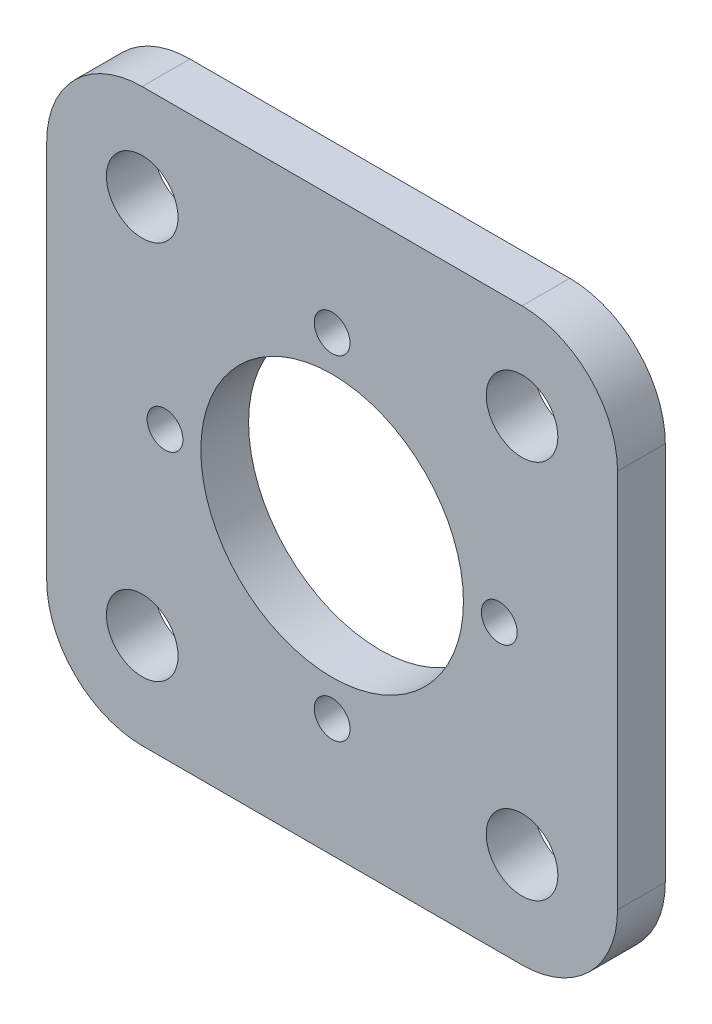
ISO-10303-21;
HEADER;
FILE_DESCRIPTION(('STEP AP214'),'2;1');
FILE_NAME('part.step','',(''),(''),'','','');
FILE_SCHEMA(('AUTOMOTIVE_DESIGN { 1 0 10303 214 1 1 1 1 }'));
ENDSEC;
DATA;
#1=APPLICATION_CONTEXT('core data for automotive mechanical design processes');
#2=APPLICATION_PROTOCOL_DEFINITION('international standard','automotive_design',2000,#1);
#3=PRODUCT_CONTEXT('',#1,'mechanical');
#4=PRODUCT('Part','Part','',(#3));
#5=PRODUCT_RELATED_PRODUCT_CATEGORY('part','',(#4));
#6=PRODUCT_DEFINITION_FORMATION('','',#4);
#7=PRODUCT_DEFINITION_CONTEXT('part definition',#1,'design');
#8=PRODUCT_DEFINITION('design','',#6,#7);
#9=PRODUCT_DEFINITION_SHAPE('','',#8);
#10=(LENGTH_UNIT() NAMED_UNIT(*) SI_UNIT(.MILLI.,.METRE.));
#11=(NAMED_UNIT(*) PLANE_ANGLE_UNIT() SI_UNIT($,.RADIAN.));
#12=(NAMED_UNIT(*) SI_UNIT($,.STERADIAN.) SOLID_ANGLE_UNIT());
#13=UNCERTAINTY_MEASURE_WITH_UNIT(LENGTH_MEASURE(1.E-05),#10,'distance_accuracy_value','');
#14=(GEOMETRIC_REPRESENTATION_CONTEXT(3) GLOBAL_UNCERTAINTY_ASSIGNED_CONTEXT((#13)) GLOBAL_UNIT_ASSIGNED_CONTEXT((#10,
#11,#12)) REPRESENTATION_CONTEXT('',''));
#15=CARTESIAN_POINT('',(0.,0.,0.));
#16=DIRECTION('',(0.,0.,1.));
#17=DIRECTION('',(1.,0.,0.));
#18=AXIS2_PLACEMENT_3D('',#15,#16,#17);
#19=CARTESIAN_POINT('',(-15.9099025766973,15.9099025766964,4.));
#20=DIRECTION('',(0.,0.,1.));
#21=DIRECTION('',(1.,0.,0.));
#22=AXIS2_PLACEMENT_3D('',#19,#20,#21);
#23=PLANE('',#22);
#24=CARTESIAN_POINT('',(-15.9099025766964,-15.9099025766982,4.));
#25=DIRECTION('',(0.,0.,1.));
#26=DIRECTION('',(1.,0.,0.));
#27=AXIS2_PLACEMENT_3D('',#24,#25,#26);
#28=CIRCLE('',#27,3.00000000000064);
#29=CARTESIAN_POINT('',(-12.9099025766958,-15.9099025766982,4.));
#30=VERTEX_POINT('',#29);
#31=EDGE_CURVE('E222',#30,#30,#28,.T.);
#32=ORIENTED_EDGE('',*,*,#31,.F.);
#33=EDGE_LOOP('',(#32));
#34=FACE_BOUND('',#33,.T.);
#35=CARTESIAN_POINT('',(-13.9999999999996,-3.97046679266253E-13,4.));
#36=DIRECTION('',(0.,0.,1.));
#37=DIRECTION('',(1.,0.,0.));
#38=AXIS2_PLACEMENT_3D('',#35,#36,#37);
#39=CIRCLE('',#38,1.50000000000064);
#40=CARTESIAN_POINT('',(-12.499999999999,-3.97046679266253E-13,4.));
#41=VERTEX_POINT('',#40);
#42=EDGE_CURVE('E210',#41,#41,#39,.T.);
#43=ORIENTED_EDGE('',*,*,#42,.F.);
#44=EDGE_LOOP('',(#43));
#45=FACE_BOUND('',#44,.T.);
#46=CARTESIAN_POINT('',(14.0000000000004,3.95332173747447E-13,4.));
#47=DIRECTION('',(0.,0.,1.));
#48=DIRECTION('',(1.,0.,0.));
#49=AXIS2_PLACEMENT_3D('',#46,#47,#48);
#50=CIRCLE('',#49,1.50000000000031);
#51=CARTESIAN_POINT('',(15.5000000000007,3.95332173747447E-13,4.));
#52=VERTEX_POINT('',#51);
#53=EDGE_CURVE('E198',#52,#52,#50,.T.);
#54=ORIENTED_EDGE('',*,*,#53,.F.);
#55=EDGE_LOOP('',(#54));
#56=FACE_BOUND('',#55,.T.);
#57=CARTESIAN_POINT('',(0.,14.,4.));
#58=DIRECTION('',(0.,0.,1.));
#59=DIRECTION('',(1.,0.,0.));
#60=AXIS2_PLACEMENT_3D('',#57,#58,#59);
#61=CIRCLE('',#60,1.5);
#62=CARTESIAN_POINT('',(1.5,14.,4.));
#63=VERTEX_POINT('',#62);
#64=EDGE_CURVE('E186',#63,#63,#61,.T.);
#65=ORIENTED_EDGE('',*,*,#64,.F.);
#66=EDGE_LOOP('',(#65));
#67=FACE_BOUND('',#66,.T.);
#68=CARTESIAN_POINT('',(-15.9099025766973,15.9099025766964,4.));
#69=DIRECTION('',(0.,0.,1.));
#70=DIRECTION('',(1.,0.,0.));
#71=AXIS2_PLACEMENT_3D('',#68,#69,#70);
#72=CIRCLE('',#71,8.);
#73=CARTESIAN_POINT('',(-15.9099025766973,23.9099025766965,4.));
#74=VERTEX_POINT('',#73);
#75=CARTESIAN_POINT('',(-23.9099025766973,15.9099025766964,4.));
#76=VERTEX_POINT('',#75);
#77=EDGE_CURVE('E149',#74,#76,#72,.T.);
#78=ORIENTED_EDGE('',*,*,#77,.T.);
#79=DIRECTION('',(0.,-1.,0.));
#80=VECTOR('',#79,1.);
#81=CARTESIAN_POINT('',(-23.9099025766973,15.9099025766964,4.));
#82=LINE('',#81,#80);
#83=CARTESIAN_POINT('',(-23.9099025766973,-15.9099025766974,4.));
#84=VERTEX_POINT('',#83);
#85=EDGE_CURVE('E97',#76,#84,#82,.T.);
#86=ORIENTED_EDGE('',*,*,#85,.T.);
#87=CARTESIAN_POINT('',(-15.9099025766973,-15.9099025766974,4.));
#88=DIRECTION('',(0.,0.,1.));
#89=DIRECTION('',(1.,0.,0.));
#90=AXIS2_PLACEMENT_3D('',#87,#88,#89);
#91=CIRCLE('',#90,8.);
#92=CARTESIAN_POINT('',(-15.9099025766973,-23.9099025766974,4.));
#93=VERTEX_POINT('',#92);
#94=EDGE_CURVE('E164',#84,#93,#91,.T.);
#95=ORIENTED_EDGE('',*,*,#94,.T.);
#96=DIRECTION('',(1.,0.,0.));
#97=VECTOR('',#96,1.);
#98=CARTESIAN_POINT('',(-15.9099025766973,-23.9099025766974,4.));
#99=LINE('',#98,#97);
#100=CARTESIAN_POINT('',(15.9099025766965,-23.9099025766972,4.));
#101=VERTEX_POINT('',#100);
#102=EDGE_CURVE('E177',#93,#101,#99,.T.);
#103=ORIENTED_EDGE('',*,*,#102,.T.);
#104=CARTESIAN_POINT('',(15.9099025766965,-15.9099025766974,4.));
#105=DIRECTION('',(0.,0.,1.));
#106=DIRECTION('',(1.,0.,0.));
#107=AXIS2_PLACEMENT_3D('',#104,#105,#106);
#108=CIRCLE('',#107,7.99999999999988);
#109=CARTESIAN_POINT('',(23.9099025766963,-15.9099025766972,4.));
#110=VERTEX_POINT('',#109);
#111=EDGE_CURVE('E116',#101,#110,#108,.T.);
#112=ORIENTED_EDGE('',*,*,#111,.T.);
#113=DIRECTION('',(0.,1.,0.));
#114=VECTOR('',#113,1.);
#115=CARTESIAN_POINT('',(23.9099025766963,15.9099025766964,4.));
#116=LINE('',#115,#114);
#117=CARTESIAN_POINT('',(23.9099025766964,15.9099025766964,4.));
#118=VERTEX_POINT('',#117);
#119=EDGE_CURVE('E110',#110,#118,#116,.T.);
#120=ORIENTED_EDGE('',*,*,#119,.T.);
#121=CARTESIAN_POINT('',(15.9099025766965,15.9099025766965,4.));
#122=DIRECTION('',(0.,0.,1.));
#123=DIRECTION('',(1.,0.,0.));
#124=AXIS2_PLACEMENT_3D('',#121,#122,#123);
#125=CIRCLE('',#124,7.99999999999988);
#126=CARTESIAN_POINT('',(15.9099025766965,23.9099025766965,4.));
#127=VERTEX_POINT('',#126);
#128=EDGE_CURVE('E114',#118,#127,#125,.T.);
#129=ORIENTED_EDGE('',*,*,#128,.T.);
#130=DIRECTION('',(-1.,0.,0.));
#131=VECTOR('',#130,1.);
#132=CARTESIAN_POINT('',(-15.9099025766973,23.9099025766965,4.));
#133=LINE('',#132,#131);
#134=EDGE_CURVE('E54',#127,#74,#133,.T.);
#135=ORIENTED_EDGE('',*,*,#134,.T.);
#136=EDGE_LOOP('',(#78,#86,#95,#103,#112,#120,#129,#135));
#137=FACE_BOUND('',#136,.T.);
#138=CARTESIAN_POINT('',(0.,0.,4.));
#139=DIRECTION('',(0.,0.,1.));
#140=DIRECTION('',(1.,0.,0.));
#141=AXIS2_PLACEMENT_3D('',#138,#139,#140);
#142=CIRCLE('',#141,11.);
#143=CARTESIAN_POINT('',(11.,0.,4.));
#144=VERTEX_POINT('',#143);
#145=EDGE_CURVE('E138',#144,#144,#142,.T.);
#146=ORIENTED_EDGE('',*,*,#145,.F.);
#147=EDGE_LOOP('',(#146));
#148=FACE_BOUND('',#147,.T.);
#149=CARTESIAN_POINT('',(15.9099025766973,15.9099025766974,4.));
#150=DIRECTION('',(0.,0.,1.));
#151=DIRECTION('',(1.,0.,0.));
#152=AXIS2_PLACEMENT_3D('',#149,#150,#151);
#153=CIRCLE('',#152,3.);
#154=CARTESIAN_POINT('',(18.9099025766973,15.9099025766974,4.));
#155=VERTEX_POINT('',#154);
#156=EDGE_CURVE('E192',#155,#155,#153,.T.);
#157=ORIENTED_EDGE('',*,*,#156,.F.);
#158=EDGE_LOOP('',(#157));
#159=FACE_BOUND('',#158,.T.);
#160=CARTESIAN_POINT('',(7.90664347494893E-13,-14.,4.));
#161=DIRECTION('',(0.,0.,1.));
#162=DIRECTION('',(1.,0.,0.));
#163=AXIS2_PLACEMENT_3D('',#160,#161,#162);
#164=CIRCLE('',#163,1.50000000000085);
#165=CARTESIAN_POINT('',(1.50000000000164,-14.,4.));
#166=VERTEX_POINT('',#165);
#167=EDGE_CURVE('E204',#166,#166,#164,.T.);
#168=ORIENTED_EDGE('',*,*,#167,.F.);
#169=EDGE_LOOP('',(#168));
#170=FACE_BOUND('',#169,.T.);
#171=CARTESIAN_POINT('',(15.9099025766982,-15.9099025766973,4.));
#172=DIRECTION('',(0.,0.,1.));
#173=DIRECTION('',(1.,0.,0.));
#174=AXIS2_PLACEMENT_3D('',#171,#172,#173);
#175=CIRCLE('',#174,2.99999999999977);
#176=CARTESIAN_POINT('',(18.909902576698,-15.9099025766973,4.));
#177=VERTEX_POINT('',#176);
#178=EDGE_CURVE('E216',#177,#177,#175,.T.);
#179=ORIENTED_EDGE('',*,*,#178,.F.);
#180=EDGE_LOOP('',(#179));
#181=FACE_BOUND('',#180,.T.);
#182=CARTESIAN_POINT('',(-15.9099025766973,15.9099025766964,4.));
#183=DIRECTION('',(0.,0.,1.));
#184=DIRECTION('',(1.,0.,0.));
#185=AXIS2_PLACEMENT_3D('',#182,#183,#184);
#186=CIRCLE('',#185,3.00000000000093);
#187=CARTESIAN_POINT('',(-12.9099025766964,15.9099025766964,4.));
#188=VERTEX_POINT('',#187);
#189=EDGE_CURVE('E228',#188,#188,#186,.T.);
#190=ORIENTED_EDGE('',*,*,#189,.F.);
#191=EDGE_LOOP('',(#190));
#192=FACE_BOUND('',#191,.T.);
#193=ADVANCED_FACE('F37',(#34,#45,#56,#67,#137,#148,#159,#170,#181,#192),#23,.T.);
#194=CARTESIAN_POINT('',(-15.9099025766973,15.9099025766964,0.));
#195=DIRECTION('',(0.,0.,1.));
#196=DIRECTION('',(1.,0.,0.));
#197=AXIS2_PLACEMENT_3D('',#194,#195,#196);
#198=PLANE('',#197);
#199=CARTESIAN_POINT('',(-15.9099025766973,15.9099025766964,0.));
#200=DIRECTION('',(0.,0.,1.));
#201=DIRECTION('',(1.,0.,0.));
#202=AXIS2_PLACEMENT_3D('',#199,#200,#201);
#203=CIRCLE('',#202,8.);
#204=CARTESIAN_POINT('',(-15.9099025766973,23.9099025766965,0.));
#205=VERTEX_POINT('',#204);
#206=CARTESIAN_POINT('',(-23.9099025766973,15.9099025766964,0.));
#207=VERTEX_POINT('',#206);
#208=EDGE_CURVE('E134',#205,#207,#203,.T.);
#209=ORIENTED_EDGE('',*,*,#208,.F.);
#210=DIRECTION('',(-1.,0.,0.));
#211=VECTOR('',#210,1.);
#212=CARTESIAN_POINT('',(-15.9099025766973,23.9099025766965,0.));
#213=LINE('',#212,#211);
#214=CARTESIAN_POINT('',(15.9099025766965,23.9099025766965,0.));
#215=VERTEX_POINT('',#214);
#216=EDGE_CURVE('E89',#215,#205,#213,.T.);
#217=ORIENTED_EDGE('',*,*,#216,.F.);
#218=CARTESIAN_POINT('',(15.9099025766965,15.9099025766965,0.));
#219=DIRECTION('',(0.,0.,1.));
#220=DIRECTION('',(1.,0.,0.));
#221=AXIS2_PLACEMENT_3D('',#218,#219,#220);
#222=CIRCLE('',#221,7.99999999999988);
#223=CARTESIAN_POINT('',(23.9099025766964,15.9099025766964,0.));
#224=VERTEX_POINT('',#223);
#225=EDGE_CURVE('E83',#224,#215,#222,.T.);
#226=ORIENTED_EDGE('',*,*,#225,.F.);
#227=DIRECTION('',(0.,1.,0.));
#228=VECTOR('',#227,1.);
#229=CARTESIAN_POINT('',(23.9099025766963,15.9099025766964,0.));
#230=LINE('',#229,#228);
#231=CARTESIAN_POINT('',(23.9099025766963,-15.9099025766972,0.));
#232=VERTEX_POINT('',#231);
#233=EDGE_CURVE('E124',#232,#224,#230,.T.);
#234=ORIENTED_EDGE('',*,*,#233,.F.);
#235=CARTESIAN_POINT('',(15.9099025766965,-15.9099025766974,0.));
#236=DIRECTION('',(0.,0.,1.));
#237=DIRECTION('',(1.,0.,0.));
#238=AXIS2_PLACEMENT_3D('',#235,#236,#237);
#239=CIRCLE('',#238,7.99999999999988);
#240=CARTESIAN_POINT('',(15.9099025766965,-23.9099025766972,0.));
#241=VERTEX_POINT('',#240);
#242=EDGE_CURVE('E144',#241,#232,#239,.T.);
#243=ORIENTED_EDGE('',*,*,#242,.F.);
#244=DIRECTION('',(1.,0.,0.));
#245=VECTOR('',#244,1.);
#246=CARTESIAN_POINT('',(-15.9099025766973,-23.9099025766974,0.));
#247=LINE('',#246,#245);
#248=CARTESIAN_POINT('',(-15.9099025766973,-23.9099025766974,0.));
#249=VERTEX_POINT('',#248);
#250=EDGE_CURVE('E142',#249,#241,#247,.T.);
#251=ORIENTED_EDGE('',*,*,#250,.F.);
#252=CARTESIAN_POINT('',(-15.9099025766973,-15.9099025766974,0.));
#253=DIRECTION('',(0.,0.,1.));
#254=DIRECTION('',(1.,0.,0.));
#255=AXIS2_PLACEMENT_3D('',#252,#253,#254);
#256=CIRCLE('',#255,8.);
#257=CARTESIAN_POINT('',(-23.9099025766973,-15.9099025766974,0.));
#258=VERTEX_POINT('',#257);
#259=EDGE_CURVE('E140',#258,#249,#256,.T.);
#260=ORIENTED_EDGE('',*,*,#259,.F.);
#261=DIRECTION('',(0.,-1.,0.));
#262=VECTOR('',#261,1.);
#263=CARTESIAN_POINT('',(-23.9099025766973,15.9099025766964,0.));
#264=LINE('',#263,#262);
#265=EDGE_CURVE('E137',#207,#258,#264,.T.);
#266=ORIENTED_EDGE('',*,*,#265,.F.);
#267=EDGE_LOOP('',(#209,#217,#226,#234,#243,#251,#260,#266));
#268=FACE_BOUND('',#267,.T.);
#269=CARTESIAN_POINT('',(0.,0.,0.));
#270=DIRECTION('',(0.,0.,1.));
#271=DIRECTION('',(1.,0.,0.));
#272=AXIS2_PLACEMENT_3D('',#269,#270,#271);
#273=CIRCLE('',#272,11.);
#274=CARTESIAN_POINT('',(11.,0.,0.));
#275=VERTEX_POINT('',#274);
#276=EDGE_CURVE('E183',#275,#275,#273,.T.);
#277=ORIENTED_EDGE('',*,*,#276,.T.);
#278=EDGE_LOOP('',(#277));
#279=FACE_BOUND('',#278,.T.);
#280=CARTESIAN_POINT('',(0.,14.,0.));
#281=DIRECTION('',(0.,0.,1.));
#282=DIRECTION('',(1.,0.,0.));
#283=AXIS2_PLACEMENT_3D('',#280,#281,#282);
#284=CIRCLE('',#283,1.5);
#285=CARTESIAN_POINT('',(1.5,14.,0.));
#286=VERTEX_POINT('',#285);
#287=EDGE_CURVE('E189',#286,#286,#284,.T.);
#288=ORIENTED_EDGE('',*,*,#287,.T.);
#289=EDGE_LOOP('',(#288));
#290=FACE_BOUND('',#289,.T.);
#291=CARTESIAN_POINT('',(15.9099025766973,15.9099025766974,0.));
#292=DIRECTION('',(0.,0.,1.));
#293=DIRECTION('',(1.,0.,0.));
#294=AXIS2_PLACEMENT_3D('',#291,#292,#293);
#295=CIRCLE('',#294,3.);
#296=CARTESIAN_POINT('',(18.9099025766973,15.9099025766974,0.));
#297=VERTEX_POINT('',#296);
#298=EDGE_CURVE('E195',#297,#297,#295,.T.);
#299=ORIENTED_EDGE('',*,*,#298,.T.);
#300=EDGE_LOOP('',(#299));
#301=FACE_BOUND('',#300,.T.);
#302=CARTESIAN_POINT('',(14.0000000000004,3.95332173747447E-13,0.));
#303=DIRECTION('',(0.,0.,1.));
#304=DIRECTION('',(1.,0.,0.));
#305=AXIS2_PLACEMENT_3D('',#302,#303,#304);
#306=CIRCLE('',#305,1.50000000000031);
#307=CARTESIAN_POINT('',(15.5000000000007,3.95332173747447E-13,0.));
#308=VERTEX_POINT('',#307);
#309=EDGE_CURVE('E201',#308,#308,#306,.T.);
#310=ORIENTED_EDGE('',*,*,#309,.T.);
#311=EDGE_LOOP('',(#310));
#312=FACE_BOUND('',#311,.T.);
#313=CARTESIAN_POINT('',(7.90664347494893E-13,-14.,0.));
#314=DIRECTION('',(0.,0.,1.));
#315=DIRECTION('',(1.,0.,0.));
#316=AXIS2_PLACEMENT_3D('',#313,#314,#315);
#317=CIRCLE('',#316,1.50000000000085);
#318=CARTESIAN_POINT('',(1.50000000000164,-14.,0.));
#319=VERTEX_POINT('',#318);
#320=EDGE_CURVE('E207',#319,#319,#317,.T.);
#321=ORIENTED_EDGE('',*,*,#320,.T.);
#322=EDGE_LOOP('',(#321));
#323=FACE_BOUND('',#322,.T.);
#324=CARTESIAN_POINT('',(-13.9999999999996,-3.97046679266253E-13,0.));
#325=DIRECTION('',(0.,0.,1.));
#326=DIRECTION('',(1.,0.,0.));
#327=AXIS2_PLACEMENT_3D('',#324,#325,#326);
#328=CIRCLE('',#327,1.50000000000064);
#329=CARTESIAN_POINT('',(-12.499999999999,-3.97046679266253E-13,0.));
#330=VERTEX_POINT('',#329);
#331=EDGE_CURVE('E213',#330,#330,#328,.T.);
#332=ORIENTED_EDGE('',*,*,#331,.T.);
#333=EDGE_LOOP('',(#332));
#334=FACE_BOUND('',#333,.T.);
#335=CARTESIAN_POINT('',(15.9099025766982,-15.9099025766973,0.));
#336=DIRECTION('',(0.,0.,1.));
#337=DIRECTION('',(1.,0.,0.));
#338=AXIS2_PLACEMENT_3D('',#335,#336,#337);
#339=CIRCLE('',#338,2.99999999999977);
#340=CARTESIAN_POINT('',(18.909902576698,-15.9099025766973,0.));
#341=VERTEX_POINT('',#340);
#342=EDGE_CURVE('E219',#341,#341,#339,.T.);
#343=ORIENTED_EDGE('',*,*,#342,.T.);
#344=EDGE_LOOP('',(#343));
#345=FACE_BOUND('',#344,.T.);
#346=CARTESIAN_POINT('',(-15.9099025766964,-15.9099025766982,0.));
#347=DIRECTION('',(0.,0.,1.));
#348=DIRECTION('',(1.,0.,0.));
#349=AXIS2_PLACEMENT_3D('',#346,#347,#348);
#350=CIRCLE('',#349,3.00000000000064);
#351=CARTESIAN_POINT('',(-12.9099025766958,-15.9099025766982,0.));
#352=VERTEX_POINT('',#351);
#353=EDGE_CURVE('E225',#352,#352,#350,.T.);
#354=ORIENTED_EDGE('',*,*,#353,.T.);
#355=EDGE_LOOP('',(#354));
#356=FACE_BOUND('',#355,.T.);
#357=CARTESIAN_POINT('',(-15.9099025766973,15.9099025766964,0.));
#358=DIRECTION('',(0.,0.,1.));
#359=DIRECTION('',(1.,0.,0.));
#360=AXIS2_PLACEMENT_3D('',#357,#358,#359);
#361=CIRCLE('',#360,3.00000000000093);
#362=CARTESIAN_POINT('',(-12.9099025766964,15.9099025766964,0.));
#363=VERTEX_POINT('',#362);
#364=EDGE_CURVE('E231',#363,#363,#361,.T.);
#365=ORIENTED_EDGE('',*,*,#364,.T.);
#366=EDGE_LOOP('',(#365));
#367=FACE_BOUND('',#366,.T.);
#368=ADVANCED_FACE('F168',(#268,#279,#290,#301,#312,#323,#334,#345,#356,#367),#198,.F.);
#369=CARTESIAN_POINT('',(-15.9099025766973,15.9099025766964,4.));
#370=DIRECTION('',(0.,0.,-1.));
#371=DIRECTION('',(-1.,0.,0.));
#372=AXIS2_PLACEMENT_3D('',#369,#370,#371);
#373=CYLINDRICAL_SURFACE('',#372,8.);
#374=ORIENTED_EDGE('',*,*,#208,.T.);
#375=DIRECTION('',(0.,0.,-1.));
#376=VECTOR('',#375,1.);
#377=CARTESIAN_POINT('',(-23.9099025766973,15.9099025766964,4.));
#378=LINE('',#377,#376);
#379=EDGE_CURVE('E11',#76,#207,#378,.T.);
#380=ORIENTED_EDGE('',*,*,#379,.F.);
#381=ORIENTED_EDGE('',*,*,#77,.F.);
#382=DIRECTION('',(0.,0.,-1.));
#383=VECTOR('',#382,1.);
#384=CARTESIAN_POINT('',(-15.9099025766973,23.9099025766965,4.));
#385=LINE('',#384,#383);
#386=EDGE_CURVE('E130',#74,#205,#385,.T.);
#387=ORIENTED_EDGE('',*,*,#386,.T.);
#388=EDGE_LOOP('',(#374,#380,#381,#387));
#389=FACE_BOUND('',#388,.T.);
#390=ADVANCED_FACE('F39',(#389),#373,.T.);
#391=CARTESIAN_POINT('',(-23.9099025766973,15.9099025766964,4.));
#392=DIRECTION('',(1.,0.,0.));
#393=DIRECTION('',(0.,0.,-1.));
#394=AXIS2_PLACEMENT_3D('',#391,#392,#393);
#395=PLANE('',#394);
#396=ORIENTED_EDGE('',*,*,#265,.T.);
#397=DIRECTION('',(0.,0.,-1.));
#398=VECTOR('',#397,1.);
#399=CARTESIAN_POINT('',(-23.9099025766973,-15.9099025766974,4.));
#400=LINE('',#399,#398);
#401=EDGE_CURVE('E46',#84,#258,#400,.T.);
#402=ORIENTED_EDGE('',*,*,#401,.F.);
#403=ORIENTED_EDGE('',*,*,#85,.F.);
#404=ORIENTED_EDGE('',*,*,#379,.T.);
#405=EDGE_LOOP('',(#396,#402,#403,#404));
#406=FACE_BOUND('',#405,.T.);
#407=ADVANCED_FACE('F265',(#406),#395,.F.);
#408=CARTESIAN_POINT('',(-15.9099025766973,-15.9099025766974,4.));
#409=DIRECTION('',(0.,0.,-1.));
#410=DIRECTION('',(-1.,0.,0.));
#411=AXIS2_PLACEMENT_3D('',#408,#409,#410);
#412=CYLINDRICAL_SURFACE('',#411,8.);
#413=ORIENTED_EDGE('',*,*,#259,.T.);
#414=DIRECTION('',(0.,0.,-1.));
#415=VECTOR('',#414,1.);
#416=CARTESIAN_POINT('',(-15.9099025766973,-23.9099025766974,4.));
#417=LINE('',#416,#415);
#418=EDGE_CURVE('E156',#93,#249,#417,.T.);
#419=ORIENTED_EDGE('',*,*,#418,.F.);
#420=ORIENTED_EDGE('',*,*,#94,.F.);
#421=ORIENTED_EDGE('',*,*,#401,.T.);
#422=EDGE_LOOP('',(#413,#419,#420,#421));
#423=FACE_BOUND('',#422,.T.);
#424=ADVANCED_FACE('F162',(#423),#412,.T.);
#425=CARTESIAN_POINT('',(-15.9099025766973,-23.9099025766974,4.));
#426=DIRECTION('',(0.,1.,0.));
#427=DIRECTION('',(0.,0.,1.));
#428=AXIS2_PLACEMENT_3D('',#425,#426,#427);
#429=PLANE('',#428);
#430=ORIENTED_EDGE('',*,*,#250,.T.);
#431=DIRECTION('',(0.,0.,-1.));
#432=VECTOR('',#431,1.);
#433=CARTESIAN_POINT('',(15.9099025766965,-23.9099025766972,4.));
#434=LINE('',#433,#432);
#435=EDGE_CURVE('E153',#101,#241,#434,.T.);
#436=ORIENTED_EDGE('',*,*,#435,.F.);
#437=ORIENTED_EDGE('',*,*,#102,.F.);
#438=ORIENTED_EDGE('',*,*,#418,.T.);
#439=EDGE_LOOP('',(#430,#436,#437,#438));
#440=FACE_BOUND('',#439,.T.);
#441=ADVANCED_FACE('F173',(#440),#429,.F.);
#442=CARTESIAN_POINT('',(15.9099025766965,-15.9099025766974,4.));
#443=DIRECTION('',(0.,0.,-1.));
#444=DIRECTION('',(-1.,0.,0.));
#445=AXIS2_PLACEMENT_3D('',#442,#443,#444);
#446=CYLINDRICAL_SURFACE('',#445,7.99999999999988);
#447=ORIENTED_EDGE('',*,*,#242,.T.);
#448=DIRECTION('',(0.,0.,-1.));
#449=VECTOR('',#448,1.);
#450=CARTESIAN_POINT('',(23.9099025766963,-15.9099025766972,4.));
#451=LINE('',#450,#449);
#452=EDGE_CURVE('E125',#110,#232,#451,.T.);
#453=ORIENTED_EDGE('',*,*,#452,.F.);
#454=ORIENTED_EDGE('',*,*,#111,.F.);
#455=ORIENTED_EDGE('',*,*,#435,.T.);
#456=EDGE_LOOP('',(#447,#453,#454,#455));
#457=FACE_BOUND('',#456,.T.);
#458=ADVANCED_FACE('F176',(#457),#446,.T.);
#459=CARTESIAN_POINT('',(23.9099025766963,15.9099025766964,4.));
#460=DIRECTION('',(-1.,0.,0.));
#461=DIRECTION('',(0.,-1.,0.));
#462=AXIS2_PLACEMENT_3D('',#459,#460,#461);
#463=PLANE('',#462);
#464=ORIENTED_EDGE('',*,*,#233,.T.);
#465=DIRECTION('',(0.,0.,-1.));
#466=VECTOR('',#465,1.);
#467=CARTESIAN_POINT('',(23.9099025766964,15.9099025766964,4.));
#468=LINE('',#467,#466);
#469=EDGE_CURVE('E121',#118,#224,#468,.T.);
#470=ORIENTED_EDGE('',*,*,#469,.F.);
#471=ORIENTED_EDGE('',*,*,#119,.F.);
#472=ORIENTED_EDGE('',*,*,#452,.T.);
#473=EDGE_LOOP('',(#464,#470,#471,#472));
#474=FACE_BOUND('',#473,.T.);
#475=ADVANCED_FACE('F122',(#474),#463,.F.);
#476=CARTESIAN_POINT('',(15.9099025766965,15.9099025766965,4.));
#477=DIRECTION('',(0.,0.,-1.));
#478=DIRECTION('',(-1.,0.,0.));
#479=AXIS2_PLACEMENT_3D('',#476,#477,#478);
#480=CYLINDRICAL_SURFACE('',#479,7.99999999999988);
#481=ORIENTED_EDGE('',*,*,#225,.T.);
#482=DIRECTION('',(0.,0.,-1.));
#483=VECTOR('',#482,1.);
#484=CARTESIAN_POINT('',(15.9099025766965,23.9099025766965,4.));
#485=LINE('',#484,#483);
#486=EDGE_CURVE('E126',#127,#215,#485,.T.);
#487=ORIENTED_EDGE('',*,*,#486,.F.);
#488=ORIENTED_EDGE('',*,*,#128,.F.);
#489=ORIENTED_EDGE('',*,*,#469,.T.);
#490=EDGE_LOOP('',(#481,#487,#488,#489));
#491=FACE_BOUND('',#490,.T.);
#492=ADVANCED_FACE('F128',(#491),#480,.T.);
#493=CARTESIAN_POINT('',(-15.9099025766973,23.9099025766965,4.));
#494=DIRECTION('',(0.,-1.,0.));
#495=DIRECTION('',(0.,0.,-1.));
#496=AXIS2_PLACEMENT_3D('',#493,#494,#495);
#497=PLANE('',#496);
#498=ORIENTED_EDGE('',*,*,#216,.T.);
#499=ORIENTED_EDGE('',*,*,#386,.F.);
#500=ORIENTED_EDGE('',*,*,#134,.F.);
#501=ORIENTED_EDGE('',*,*,#486,.T.);
#502=EDGE_LOOP('',(#498,#499,#500,#501));
#503=FACE_BOUND('',#502,.T.);
#504=ADVANCED_FACE('F253',(#503),#497,.F.);
#505=CARTESIAN_POINT('',(0.,0.,4.));
#506=DIRECTION('',(0.,0.,-1.));
#507=DIRECTION('',(-1.,0.,0.));
#508=AXIS2_PLACEMENT_3D('',#505,#506,#507);
#509=CYLINDRICAL_SURFACE('',#508,11.);
#510=ORIENTED_EDGE('',*,*,#145,.T.);
#511=EDGE_LOOP('',(#510));
#512=FACE_BOUND('',#511,.T.);
#513=ORIENTED_EDGE('',*,*,#276,.F.);
#514=EDGE_LOOP('',(#513));
#515=FACE_BOUND('',#514,.T.);
#516=ADVANCED_FACE('F250',(#512,#515),#509,.F.);
#517=CARTESIAN_POINT('',(0.,14.,4.));
#518=DIRECTION('',(0.,0.,-1.));
#519=DIRECTION('',(-1.,0.,0.));
#520=AXIS2_PLACEMENT_3D('',#517,#518,#519);
#521=CYLINDRICAL_SURFACE('',#520,1.5);
#522=ORIENTED_EDGE('',*,*,#64,.T.);
#523=EDGE_LOOP('',(#522));
#524=FACE_BOUND('',#523,.T.);
#525=ORIENTED_EDGE('',*,*,#287,.F.);
#526=EDGE_LOOP('',(#525));
#527=FACE_BOUND('',#526,.T.);
#528=ADVANCED_FACE('F329',(#524,#527),#521,.F.);
#529=CARTESIAN_POINT('',(15.9099025766973,15.9099025766974,4.));
#530=DIRECTION('',(0.,0.,-1.));
#531=DIRECTION('',(-1.,0.,0.));
#532=AXIS2_PLACEMENT_3D('',#529,#530,#531);
#533=CYLINDRICAL_SURFACE('',#532,3.);
#534=ORIENTED_EDGE('',*,*,#156,.T.);
#535=EDGE_LOOP('',(#534));
#536=FACE_BOUND('',#535,.T.);
#537=ORIENTED_EDGE('',*,*,#298,.F.);
#538=EDGE_LOOP('',(#537));
#539=FACE_BOUND('',#538,.T.);
#540=ADVANCED_FACE('F337',(#536,#539),#533,.F.);
#541=CARTESIAN_POINT('',(14.0000000000004,3.95332173747447E-13,4.));
#542=DIRECTION('',(0.,0.,-1.));
#543=DIRECTION('',(-1.,0.,0.));
#544=AXIS2_PLACEMENT_3D('',#541,#542,#543);
#545=CYLINDRICAL_SURFACE('',#544,1.50000000000031);
#546=ORIENTED_EDGE('',*,*,#53,.T.);
#547=EDGE_LOOP('',(#546));
#548=FACE_BOUND('',#547,.T.);
#549=ORIENTED_EDGE('',*,*,#309,.F.);
#550=EDGE_LOOP('',(#549));
#551=FACE_BOUND('',#550,.T.);
#552=ADVANCED_FACE('F345',(#548,#551),#545,.F.);
#553=CARTESIAN_POINT('',(7.90664347494893E-13,-14.,4.));
#554=DIRECTION('',(0.,0.,-1.));
#555=DIRECTION('',(-1.,0.,0.));
#556=AXIS2_PLACEMENT_3D('',#553,#554,#555);
#557=CYLINDRICAL_SURFACE('',#556,1.50000000000085);
#558=ORIENTED_EDGE('',*,*,#167,.T.);
#559=EDGE_LOOP('',(#558));
#560=FACE_BOUND('',#559,.T.);
#561=ORIENTED_EDGE('',*,*,#320,.F.);
#562=EDGE_LOOP('',(#561));
#563=FACE_BOUND('',#562,.T.);
#564=ADVANCED_FACE('F354',(#560,#563),#557,.F.);
#565=CARTESIAN_POINT('',(-13.9999999999996,-3.97046679266253E-13,4.));
#566=DIRECTION('',(0.,0.,-1.));
#567=DIRECTION('',(-1.,0.,0.));
#568=AXIS2_PLACEMENT_3D('',#565,#566,#567);
#569=CYLINDRICAL_SURFACE('',#568,1.50000000000064);
#570=ORIENTED_EDGE('',*,*,#42,.T.);
#571=EDGE_LOOP('',(#570));
#572=FACE_BOUND('',#571,.T.);
#573=ORIENTED_EDGE('',*,*,#331,.F.);
#574=EDGE_LOOP('',(#573));
#575=FACE_BOUND('',#574,.T.);
#576=ADVANCED_FACE('F363',(#572,#575),#569,.F.);
#577=CARTESIAN_POINT('',(15.9099025766982,-15.9099025766973,4.));
#578=DIRECTION('',(0.,0.,-1.));
#579=DIRECTION('',(-1.,0.,0.));
#580=AXIS2_PLACEMENT_3D('',#577,#578,#579);
#581=CYLINDRICAL_SURFACE('',#580,2.99999999999977);
#582=ORIENTED_EDGE('',*,*,#178,.T.);
#583=EDGE_LOOP('',(#582));
#584=FACE_BOUND('',#583,.T.);
#585=ORIENTED_EDGE('',*,*,#342,.F.);
#586=EDGE_LOOP('',(#585));
#587=FACE_BOUND('',#586,.T.);
#588=ADVANCED_FACE('F372',(#584,#587),#581,.F.);
#589=CARTESIAN_POINT('',(-15.9099025766964,-15.9099025766982,4.));
#590=DIRECTION('',(0.,0.,-1.));
#591=DIRECTION('',(-1.,0.,0.));
#592=AXIS2_PLACEMENT_3D('',#589,#590,#591);
#593=CYLINDRICAL_SURFACE('',#592,3.00000000000064);
#594=ORIENTED_EDGE('',*,*,#31,.T.);
#595=EDGE_LOOP('',(#594));
#596=FACE_BOUND('',#595,.T.);
#597=ORIENTED_EDGE('',*,*,#353,.F.);
#598=EDGE_LOOP('',(#597));
#599=FACE_BOUND('',#598,.T.);
#600=ADVANCED_FACE('F381',(#596,#599),#593,.F.);
#601=CARTESIAN_POINT('',(-15.9099025766973,15.9099025766964,4.));
#602=DIRECTION('',(0.,0.,-1.));
#603=DIRECTION('',(-1.,0.,0.));
#604=AXIS2_PLACEMENT_3D('',#601,#602,#603);
#605=CYLINDRICAL_SURFACE('',#604,3.00000000000093);
#606=ORIENTED_EDGE('',*,*,#189,.T.);
#607=EDGE_LOOP('',(#606));
#608=FACE_BOUND('',#607,.T.);
#609=ORIENTED_EDGE('',*,*,#364,.F.);
#610=EDGE_LOOP('',(#609));
#611=FACE_BOUND('',#610,.T.);
#612=ADVANCED_FACE('F237',(#608,#611),#605,.F.);
#613=CLOSED_SHELL('',(#193,#368,#390,#407,#424,#441,#458,#475,#492,#504,#516,#528,#540,#552,
#564,#576,#588,#600,#612));
#614=MANIFOLD_SOLID_BREP('B2',#613);
#615=ADVANCED_BREP_SHAPE_REPRESENTATION('',(#18,#614),#14);
#616=SHAPE_DEFINITION_REPRESENTATION(#9,#615);
ENDSEC;
END-ISO-10303-21;
